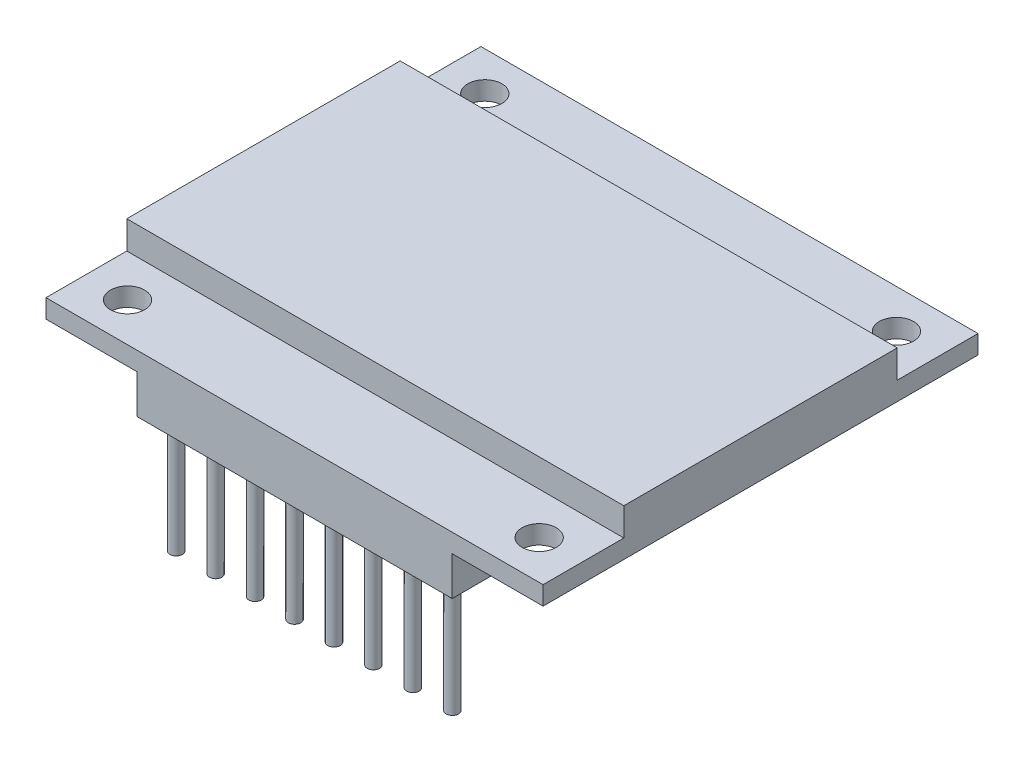
ISO-10303-21;
HEADER;
FILE_DESCRIPTION(('STEP AP214'),'2;1');
FILE_NAME('part.step','',(''),(''),'','','');
FILE_SCHEMA(('AUTOMOTIVE_DESIGN { 1 0 10303 214 1 1 1 1 }'));
ENDSEC;
DATA;
#1=APPLICATION_CONTEXT('core data for automotive mechanical design processes');
#2=APPLICATION_PROTOCOL_DEFINITION('international standard','automotive_design',2000,#1);
#3=PRODUCT_CONTEXT('',#1,'mechanical');
#4=PRODUCT('Part','Part','',(#3));
#5=PRODUCT_RELATED_PRODUCT_CATEGORY('part','',(#4));
#6=PRODUCT_DEFINITION_FORMATION('','',#4);
#7=PRODUCT_DEFINITION_CONTEXT('part definition',#1,'design');
#8=PRODUCT_DEFINITION('design','',#6,#7);
#9=PRODUCT_DEFINITION_SHAPE('','',#8);
#10=(LENGTH_UNIT() NAMED_UNIT(*) SI_UNIT(.MILLI.,.METRE.));
#11=(NAMED_UNIT(*) PLANE_ANGLE_UNIT() SI_UNIT($,.RADIAN.));
#12=(NAMED_UNIT(*) SI_UNIT($,.STERADIAN.) SOLID_ANGLE_UNIT());
#13=UNCERTAINTY_MEASURE_WITH_UNIT(LENGTH_MEASURE(1.E-05),#10,'distance_accuracy_value','');
#14=(GEOMETRIC_REPRESENTATION_CONTEXT(3) GLOBAL_UNCERTAINTY_ASSIGNED_CONTEXT((#13)) GLOBAL_UNIT_ASSIGNED_CONTEXT((#10,
#11,#12)) REPRESENTATION_CONTEXT('',''));
#15=CARTESIAN_POINT('',(0.,0.,0.));
#16=DIRECTION('',(0.,0.,1.));
#17=DIRECTION('',(1.,0.,0.));
#18=AXIS2_PLACEMENT_3D('',#15,#16,#17);
#19=CARTESIAN_POINT('',(0.,0.,0.));
#20=DIRECTION('',(0.,-1.,0.));
#21=DIRECTION('',(0.,0.,-1.));
#22=AXIS2_PLACEMENT_3D('',#19,#20,#21);
#23=PLANE('',#22);
#24=CARTESIAN_POINT('',(2.75,0.,-25.5));
#25=DIRECTION('',(0.,1.,0.));
#26=DIRECTION('',(0.,0.,1.));
#27=AXIS2_PLACEMENT_3D('',#24,#25,#26);
#28=CIRCLE('',#27,1.1);
#29=CARTESIAN_POINT('',(2.75,0.,-24.4));
#30=VERTEX_POINT('',#29);
#31=EDGE_CURVE('E251',#30,#30,#28,.T.);
#32=ORIENTED_EDGE('',*,*,#31,.T.);
#33=EDGE_LOOP('',(#32));
#34=FACE_BOUND('',#33,.T.);
#35=CARTESIAN_POINT('',(2.75,0.,-2.5));
#36=DIRECTION('',(0.,1.,0.));
#37=DIRECTION('',(0.,0.,-1.));
#38=AXIS2_PLACEMENT_3D('',#35,#36,#37);
#39=CIRCLE('',#38,1.1);
#40=CARTESIAN_POINT('',(2.75,0.,-3.6));
#41=VERTEX_POINT('',#40);
#42=EDGE_CURVE('E227',#41,#41,#39,.T.);
#43=ORIENTED_EDGE('',*,*,#42,.T.);
#44=EDGE_LOOP('',(#43));
#45=FACE_BOUND('',#44,.T.);
#46=CARTESIAN_POINT('',(29.25,0.,-2.5));
#47=DIRECTION('',(0.,1.,0.));
#48=DIRECTION('',(0.,0.,1.));
#49=AXIS2_PLACEMENT_3D('',#46,#47,#48);
#50=CIRCLE('',#49,1.1);
#51=CARTESIAN_POINT('',(29.25,0.,-1.40000000000001));
#52=VERTEX_POINT('',#51);
#53=EDGE_CURVE('E236',#52,#52,#50,.T.);
#54=ORIENTED_EDGE('',*,*,#53,.T.);
#55=EDGE_LOOP('',(#54));
#56=FACE_BOUND('',#55,.T.);
#57=CARTESIAN_POINT('',(29.25,0.,-25.5));
#58=DIRECTION('',(0.,1.,0.));
#59=DIRECTION('',(0.,0.,-1.));
#60=AXIS2_PLACEMENT_3D('',#57,#58,#59);
#61=CIRCLE('',#60,1.1);
#62=CARTESIAN_POINT('',(29.25,0.,-26.6));
#63=VERTEX_POINT('',#62);
#64=EDGE_CURVE('E244',#63,#63,#61,.T.);
#65=ORIENTED_EDGE('',*,*,#64,.T.);
#66=EDGE_LOOP('',(#65));
#67=FACE_BOUND('',#66,.T.);
#68=DIRECTION('',(1.,0.,0.));
#69=VECTOR('',#68,1.);
#70=CARTESIAN_POINT('',(5.85,0.,-2.5));
#71=LINE('',#70,#69);
#72=CARTESIAN_POINT('',(5.85,0.,-2.5));
#73=VERTEX_POINT('',#72);
#74=CARTESIAN_POINT('',(26.15,0.,-2.5));
#75=VERTEX_POINT('',#74);
#76=EDGE_CURVE('E736',#73,#75,#71,.T.);
#77=ORIENTED_EDGE('',*,*,#76,.F.);
#78=DIRECTION('',(0.,0.,-1.));
#79=VECTOR('',#78,1.);
#80=CARTESIAN_POINT('',(5.85,0.,0.));
#81=LINE('',#80,#79);
#82=CARTESIAN_POINT('',(5.85,0.,0.));
#83=VERTEX_POINT('',#82);
#84=EDGE_CURVE('E156',#83,#73,#81,.T.);
#85=ORIENTED_EDGE('',*,*,#84,.F.);
#86=DIRECTION('',(1.,0.,0.));
#87=VECTOR('',#86,1.);
#88=CARTESIAN_POINT('',(0.,0.,0.));
#89=LINE('',#88,#87);
#90=CARTESIAN_POINT('',(0.,0.,0.));
#91=VERTEX_POINT('',#90);
#92=EDGE_CURVE('E313',#91,#83,#89,.T.);
#93=ORIENTED_EDGE('',*,*,#92,.F.);
#94=DIRECTION('',(0.,0.,1.));
#95=VECTOR('',#94,1.);
#96=CARTESIAN_POINT('',(0.,0.,0.));
#97=LINE('',#96,#95);
#98=CARTESIAN_POINT('',(0.,0.,-28.));
#99=VERTEX_POINT('',#98);
#100=EDGE_CURVE('E293',#99,#91,#97,.T.);
#101=ORIENTED_EDGE('',*,*,#100,.F.);
#102=DIRECTION('',(-1.,0.,0.));
#103=VECTOR('',#102,1.);
#104=CARTESIAN_POINT('',(0.,0.,-28.));
#105=LINE('',#104,#103);
#106=CARTESIAN_POINT('',(32.,0.,-28.));
#107=VERTEX_POINT('',#106);
#108=EDGE_CURVE('E320',#107,#99,#105,.T.);
#109=ORIENTED_EDGE('',*,*,#108,.F.);
#110=DIRECTION('',(0.,0.,-1.));
#111=VECTOR('',#110,1.);
#112=CARTESIAN_POINT('',(32.,0.,0.));
#113=LINE('',#112,#111);
#114=CARTESIAN_POINT('',(32.,0.,0.));
#115=VERTEX_POINT('',#114);
#116=EDGE_CURVE('E317',#115,#107,#113,.T.);
#117=ORIENTED_EDGE('',*,*,#116,.F.);
#118=CARTESIAN_POINT('',(26.15,0.,0.));
#119=VERTEX_POINT('',#118);
#120=EDGE_CURVE('E312',#119,#115,#89,.T.);
#121=ORIENTED_EDGE('',*,*,#120,.F.);
#122=DIRECTION('',(0.,0.,1.));
#123=VECTOR('',#122,1.);
#124=CARTESIAN_POINT('',(26.15,0.,0.));
#125=LINE('',#124,#123);
#126=EDGE_CURVE('E152',#75,#119,#125,.T.);
#127=ORIENTED_EDGE('',*,*,#126,.F.);
#128=EDGE_LOOP('',(#77,#85,#93,#101,#109,#117,#121,#127));
#129=FACE_BOUND('',#128,.T.);
#130=ADVANCED_FACE('F41',(#34,#45,#56,#67,#129),#23,.T.);
#131=CARTESIAN_POINT('',(0.,1.2,0.));
#132=DIRECTION('',(0.,-1.,0.));
#133=DIRECTION('',(0.,0.,-1.));
#134=AXIS2_PLACEMENT_3D('',#131,#132,#133);
#135=PLANE('',#134);
#136=CARTESIAN_POINT('',(29.25,1.2,-25.5));
#137=DIRECTION('',(0.,1.,0.));
#138=DIRECTION('',(0.,0.,-1.));
#139=AXIS2_PLACEMENT_3D('',#136,#137,#138);
#140=CIRCLE('',#139,1.1);
#141=CARTESIAN_POINT('',(29.25,1.2,-26.6));
#142=VERTEX_POINT('',#141);
#143=EDGE_CURVE('E226',#142,#142,#140,.T.);
#144=ORIENTED_EDGE('',*,*,#143,.F.);
#145=EDGE_LOOP('',(#144));
#146=FACE_BOUND('',#145,.T.);
#147=CARTESIAN_POINT('',(2.75,1.2,-25.5));
#148=DIRECTION('',(0.,1.,0.));
#149=DIRECTION('',(0.,0.,1.));
#150=AXIS2_PLACEMENT_3D('',#147,#148,#149);
#151=CIRCLE('',#150,1.1);
#152=CARTESIAN_POINT('',(2.75,1.2,-24.4));
#153=VERTEX_POINT('',#152);
#154=EDGE_CURVE('E231',#153,#153,#151,.T.);
#155=ORIENTED_EDGE('',*,*,#154,.F.);
#156=EDGE_LOOP('',(#155));
#157=FACE_BOUND('',#156,.T.);
#158=DIRECTION('',(-1.,0.,0.));
#159=VECTOR('',#158,1.);
#160=CARTESIAN_POINT('',(0.,1.2,-22.8));
#161=LINE('',#160,#159);
#162=CARTESIAN_POINT('',(32.,1.2,-22.8));
#163=VERTEX_POINT('',#162);
#164=CARTESIAN_POINT('',(0.,1.2,-22.8));
#165=VERTEX_POINT('',#164);
#166=EDGE_CURVE('E66',#163,#165,#161,.T.);
#167=ORIENTED_EDGE('',*,*,#166,.F.);
#168=DIRECTION('',(0.,0.,-1.));
#169=VECTOR('',#168,1.);
#170=CARTESIAN_POINT('',(32.,1.2,0.));
#171=LINE('',#170,#169);
#172=CARTESIAN_POINT('',(32.,1.2,-28.));
#173=VERTEX_POINT('',#172);
#174=EDGE_CURVE('E301',#163,#173,#171,.T.);
#175=ORIENTED_EDGE('',*,*,#174,.T.);
#176=DIRECTION('',(-1.,0.,0.));
#177=VECTOR('',#176,1.);
#178=CARTESIAN_POINT('',(0.,1.2,-28.));
#179=LINE('',#178,#177);
#180=CARTESIAN_POINT('',(0.,1.2,-28.));
#181=VERTEX_POINT('',#180);
#182=EDGE_CURVE('E305',#173,#181,#179,.T.);
#183=ORIENTED_EDGE('',*,*,#182,.T.);
#184=DIRECTION('',(0.,0.,1.));
#185=VECTOR('',#184,1.);
#186=CARTESIAN_POINT('',(0.,1.2,0.));
#187=LINE('',#186,#185);
#188=EDGE_CURVE('E294',#181,#165,#187,.T.);
#189=ORIENTED_EDGE('',*,*,#188,.T.);
#190=EDGE_LOOP('',(#167,#175,#183,#189));
#191=FACE_BOUND('',#190,.T.);
#192=ADVANCED_FACE('F353',(#146,#157,#191),#135,.F.);
#193=CARTESIAN_POINT('',(29.25,1.2,-2.5));
#194=DIRECTION('',(0.,1.,0.));
#195=DIRECTION('',(0.,0.,1.));
#196=AXIS2_PLACEMENT_3D('',#193,#194,#195);
#197=CIRCLE('',#196,1.1);
#198=CARTESIAN_POINT('',(29.25,1.2,-1.40000000000001));
#199=VERTEX_POINT('',#198);
#200=EDGE_CURVE('E240',#199,#199,#197,.T.);
#201=ORIENTED_EDGE('',*,*,#200,.F.);
#202=EDGE_LOOP('',(#201));
#203=FACE_BOUND('',#202,.T.);
#204=CARTESIAN_POINT('',(2.75,1.2,-2.5));
#205=DIRECTION('',(0.,1.,0.));
#206=DIRECTION('',(0.,0.,-1.));
#207=AXIS2_PLACEMENT_3D('',#204,#205,#206);
#208=CIRCLE('',#207,1.1);
#209=CARTESIAN_POINT('',(2.75,1.2,-3.6));
#210=VERTEX_POINT('',#209);
#211=EDGE_CURVE('E232',#210,#210,#208,.T.);
#212=ORIENTED_EDGE('',*,*,#211,.F.);
#213=EDGE_LOOP('',(#212));
#214=FACE_BOUND('',#213,.T.);
#215=DIRECTION('',(1.,0.,0.));
#216=VECTOR('',#215,1.);
#217=CARTESIAN_POINT('',(0.,1.2,-5.2));
#218=LINE('',#217,#216);
#219=CARTESIAN_POINT('',(0.,1.2,-5.2));
#220=VERTEX_POINT('',#219);
#221=CARTESIAN_POINT('',(32.,1.2,-5.2));
#222=VERTEX_POINT('',#221);
#223=EDGE_CURVE('E255',#220,#222,#218,.T.);
#224=ORIENTED_EDGE('',*,*,#223,.F.);
#225=CARTESIAN_POINT('',(0.,1.2,0.));
#226=VERTEX_POINT('',#225);
#227=EDGE_CURVE('E298',#220,#226,#187,.T.);
#228=ORIENTED_EDGE('',*,*,#227,.T.);
#229=DIRECTION('',(1.,0.,0.));
#230=VECTOR('',#229,1.);
#231=CARTESIAN_POINT('',(0.,1.2,0.));
#232=LINE('',#231,#230);
#233=CARTESIAN_POINT('',(32.,1.2,0.));
#234=VERTEX_POINT('',#233);
#235=EDGE_CURVE('E297',#226,#234,#232,.T.);
#236=ORIENTED_EDGE('',*,*,#235,.T.);
#237=EDGE_CURVE('E302',#234,#222,#171,.T.);
#238=ORIENTED_EDGE('',*,*,#237,.T.);
#239=EDGE_LOOP('',(#224,#228,#236,#238));
#240=FACE_BOUND('',#239,.T.);
#241=ADVANCED_FACE('F369',(#203,#214,#240),#135,.F.);
#242=CARTESIAN_POINT('',(0.,1.2,0.));
#243=DIRECTION('',(1.,0.,0.));
#244=DIRECTION('',(0.,0.,-1.));
#245=AXIS2_PLACEMENT_3D('',#242,#243,#244);
#246=PLANE('',#245);
#247=ORIENTED_EDGE('',*,*,#100,.T.);
#248=DIRECTION('',(0.,-1.,0.));
#249=VECTOR('',#248,1.);
#250=CARTESIAN_POINT('',(0.,1.2,0.));
#251=LINE('',#250,#249);
#252=EDGE_CURVE('E11',#226,#91,#251,.T.);
#253=ORIENTED_EDGE('',*,*,#252,.F.);
#254=ORIENTED_EDGE('',*,*,#227,.F.);
#255=DIRECTION('',(0.,-1.,0.));
#256=VECTOR('',#255,1.);
#257=CARTESIAN_POINT('',(0.,3.,-5.2));
#258=LINE('',#257,#256);
#259=CARTESIAN_POINT('',(0.,3.,-5.2));
#260=VERTEX_POINT('',#259);
#261=EDGE_CURVE('E289',#260,#220,#258,.T.);
#262=ORIENTED_EDGE('',*,*,#261,.F.);
#263=DIRECTION('',(0.,0.,1.));
#264=VECTOR('',#263,1.);
#265=CARTESIAN_POINT('',(0.,3.,-22.8));
#266=LINE('',#265,#264);
#267=CARTESIAN_POINT('',(0.,3.,-22.8));
#268=VERTEX_POINT('',#267);
#269=EDGE_CURVE('E259',#268,#260,#266,.T.);
#270=ORIENTED_EDGE('',*,*,#269,.F.);
#271=DIRECTION('',(0.,-1.,0.));
#272=VECTOR('',#271,1.);
#273=CARTESIAN_POINT('',(0.,3.,-22.8));
#274=LINE('',#273,#272);
#275=EDGE_CURVE('E272',#268,#165,#274,.T.);
#276=ORIENTED_EDGE('',*,*,#275,.T.);
#277=ORIENTED_EDGE('',*,*,#188,.F.);
#278=DIRECTION('',(0.,-1.,0.));
#279=VECTOR('',#278,1.);
#280=CARTESIAN_POINT('',(0.,1.2,-28.));
#281=LINE('',#280,#279);
#282=EDGE_CURVE('E308',#181,#99,#281,.T.);
#283=ORIENTED_EDGE('',*,*,#282,.T.);
#284=EDGE_LOOP('',(#247,#253,#254,#262,#270,#276,#277,#283));
#285=FACE_BOUND('',#284,.T.);
#286=ADVANCED_FACE('F43',(#285),#246,.F.);
#287=CARTESIAN_POINT('',(0.,1.2,0.));
#288=DIRECTION('',(0.,0.,-1.));
#289=DIRECTION('',(-1.,0.,0.));
#290=AXIS2_PLACEMENT_3D('',#287,#288,#289);
#291=PLANE('',#290);
#292=ORIENTED_EDGE('',*,*,#92,.T.);
#293=DIRECTION('',(0.,1.,0.));
#294=VECTOR('',#293,1.);
#295=CARTESIAN_POINT('',(5.85,-2.5,0.));
#296=LINE('',#295,#294);
#297=CARTESIAN_POINT('',(5.85,-2.5,0.));
#298=VERTEX_POINT('',#297);
#299=EDGE_CURVE('E742',#298,#83,#296,.T.);
#300=ORIENTED_EDGE('',*,*,#299,.F.);
#301=DIRECTION('',(-1.,0.,0.));
#302=VECTOR('',#301,1.);
#303=CARTESIAN_POINT('',(5.85,-2.5,0.));
#304=LINE('',#303,#302);
#305=CARTESIAN_POINT('',(26.15,-2.5,0.));
#306=VERTEX_POINT('',#305);
#307=EDGE_CURVE('E148',#306,#298,#304,.T.);
#308=ORIENTED_EDGE('',*,*,#307,.F.);
#309=DIRECTION('',(0.,1.,0.));
#310=VECTOR('',#309,1.);
#311=CARTESIAN_POINT('',(26.15,-2.5,0.));
#312=LINE('',#311,#310);
#313=EDGE_CURVE('E58',#306,#119,#312,.T.);
#314=ORIENTED_EDGE('',*,*,#313,.T.);
#315=ORIENTED_EDGE('',*,*,#120,.T.);
#316=DIRECTION('',(0.,-1.,0.));
#317=VECTOR('',#316,1.);
#318=CARTESIAN_POINT('',(32.,1.2,0.));
#319=LINE('',#318,#317);
#320=EDGE_CURVE('E51',#234,#115,#319,.T.);
#321=ORIENTED_EDGE('',*,*,#320,.F.);
#322=ORIENTED_EDGE('',*,*,#235,.F.);
#323=ORIENTED_EDGE('',*,*,#252,.T.);
#324=EDGE_LOOP('',(#292,#300,#308,#314,#315,#321,#322,#323));
#325=FACE_BOUND('',#324,.T.);
#326=ADVANCED_FACE('F362',(#325),#291,.F.);
#327=CARTESIAN_POINT('',(32.,1.2,0.));
#328=DIRECTION('',(-1.,0.,0.));
#329=DIRECTION('',(0.,0.,1.));
#330=AXIS2_PLACEMENT_3D('',#327,#328,#329);
#331=PLANE('',#330);
#332=ORIENTED_EDGE('',*,*,#116,.T.);
#333=DIRECTION('',(0.,-1.,0.));
#334=VECTOR('',#333,1.);
#335=CARTESIAN_POINT('',(32.,1.2,-28.));
#336=LINE('',#335,#334);
#337=EDGE_CURVE('E326',#173,#107,#336,.T.);
#338=ORIENTED_EDGE('',*,*,#337,.F.);
#339=ORIENTED_EDGE('',*,*,#174,.F.);
#340=DIRECTION('',(0.,-1.,0.));
#341=VECTOR('',#340,1.);
#342=CARTESIAN_POINT('',(32.,3.,-22.8));
#343=LINE('',#342,#341);
#344=CARTESIAN_POINT('',(32.,3.,-22.8));
#345=VERTEX_POINT('',#344);
#346=EDGE_CURVE('E281',#345,#163,#343,.T.);
#347=ORIENTED_EDGE('',*,*,#346,.F.);
#348=DIRECTION('',(0.,0.,-1.));
#349=VECTOR('',#348,1.);
#350=CARTESIAN_POINT('',(32.,3.,-22.8));
#351=LINE('',#350,#349);
#352=CARTESIAN_POINT('',(32.,3.,-5.2));
#353=VERTEX_POINT('',#352);
#354=EDGE_CURVE('E266',#353,#345,#351,.T.);
#355=ORIENTED_EDGE('',*,*,#354,.F.);
#356=DIRECTION('',(0.,-1.,0.));
#357=VECTOR('',#356,1.);
#358=CARTESIAN_POINT('',(32.,3.,-5.2));
#359=LINE('',#358,#357);
#360=EDGE_CURVE('E285',#353,#222,#359,.T.);
#361=ORIENTED_EDGE('',*,*,#360,.T.);
#362=ORIENTED_EDGE('',*,*,#237,.F.);
#363=ORIENTED_EDGE('',*,*,#320,.T.);
#364=EDGE_LOOP('',(#332,#338,#339,#347,#355,#361,#362,#363));
#365=FACE_BOUND('',#364,.T.);
#366=ADVANCED_FACE('F336',(#365),#331,.F.);
#367=CARTESIAN_POINT('',(0.,1.2,-28.));
#368=DIRECTION('',(0.,0.,1.));
#369=DIRECTION('',(1.,0.,0.));
#370=AXIS2_PLACEMENT_3D('',#367,#368,#369);
#371=PLANE('',#370);
#372=ORIENTED_EDGE('',*,*,#108,.T.);
#373=ORIENTED_EDGE('',*,*,#282,.F.);
#374=ORIENTED_EDGE('',*,*,#182,.F.);
#375=ORIENTED_EDGE('',*,*,#337,.T.);
#376=EDGE_LOOP('',(#372,#373,#374,#375));
#377=FACE_BOUND('',#376,.T.);
#378=ADVANCED_FACE('F346',(#377),#371,.F.);
#379=CARTESIAN_POINT('',(0.,3.,-5.2));
#380=DIRECTION('',(0.,0.,-1.));
#381=DIRECTION('',(-1.,0.,0.));
#382=AXIS2_PLACEMENT_3D('',#379,#380,#381);
#383=PLANE('',#382);
#384=ORIENTED_EDGE('',*,*,#223,.T.);
#385=ORIENTED_EDGE('',*,*,#360,.F.);
#386=DIRECTION('',(1.,0.,0.));
#387=VECTOR('',#386,1.);
#388=CARTESIAN_POINT('',(0.,3.,-5.2));
#389=LINE('',#388,#387);
#390=EDGE_CURVE('E263',#260,#353,#389,.T.);
#391=ORIENTED_EDGE('',*,*,#390,.F.);
#392=ORIENTED_EDGE('',*,*,#261,.T.);
#393=EDGE_LOOP('',(#384,#385,#391,#392));
#394=FACE_BOUND('',#393,.T.);
#395=ADVANCED_FACE('F382',(#394),#383,.F.);
#396=CARTESIAN_POINT('',(0.,3.,-22.8));
#397=DIRECTION('',(0.,0.,1.));
#398=DIRECTION('',(1.,0.,0.));
#399=AXIS2_PLACEMENT_3D('',#396,#397,#398);
#400=PLANE('',#399);
#401=ORIENTED_EDGE('',*,*,#166,.T.);
#402=ORIENTED_EDGE('',*,*,#275,.F.);
#403=DIRECTION('',(-1.,0.,0.));
#404=VECTOR('',#403,1.);
#405=CARTESIAN_POINT('',(0.,3.,-22.8));
#406=LINE('',#405,#404);
#407=EDGE_CURVE('E269',#345,#268,#406,.T.);
#408=ORIENTED_EDGE('',*,*,#407,.F.);
#409=ORIENTED_EDGE('',*,*,#346,.T.);
#410=EDGE_LOOP('',(#401,#402,#408,#409));
#411=FACE_BOUND('',#410,.T.);
#412=ADVANCED_FACE('F355',(#411),#400,.F.);
#413=CARTESIAN_POINT('',(0.,3.,0.));
#414=DIRECTION('',(0.,1.,0.));
#415=DIRECTION('',(0.,0.,1.));
#416=AXIS2_PLACEMENT_3D('',#413,#414,#415);
#417=PLANE('',#416);
#418=ORIENTED_EDGE('',*,*,#269,.T.);
#419=ORIENTED_EDGE('',*,*,#390,.T.);
#420=ORIENTED_EDGE('',*,*,#354,.T.);
#421=ORIENTED_EDGE('',*,*,#407,.T.);
#422=EDGE_LOOP('',(#418,#419,#420,#421));
#423=FACE_BOUND('',#422,.T.);
#424=ADVANCED_FACE('F390',(#423),#417,.T.);
#425=CARTESIAN_POINT('',(2.75,0.,-25.5));
#426=DIRECTION('',(0.,1.,0.));
#427=DIRECTION('',(0.,0.,1.));
#428=AXIS2_PLACEMENT_3D('',#425,#426,#427);
#429=CYLINDRICAL_SURFACE('',#428,1.1);
#430=ORIENTED_EDGE('',*,*,#31,.F.);
#431=EDGE_LOOP('',(#430));
#432=FACE_BOUND('',#431,.T.);
#433=ORIENTED_EDGE('',*,*,#154,.T.);
#434=EDGE_LOOP('',(#433));
#435=FACE_BOUND('',#434,.T.);
#436=ADVANCED_FACE('F395',(#432,#435),#429,.F.);
#437=CARTESIAN_POINT('',(2.75,0.,-2.5));
#438=DIRECTION('',(0.,1.,0.));
#439=DIRECTION('',(0.,0.,1.));
#440=AXIS2_PLACEMENT_3D('',#437,#438,#439);
#441=CYLINDRICAL_SURFACE('',#440,1.1);
#442=ORIENTED_EDGE('',*,*,#42,.F.);
#443=EDGE_LOOP('',(#442));
#444=FACE_BOUND('',#443,.T.);
#445=ORIENTED_EDGE('',*,*,#211,.T.);
#446=EDGE_LOOP('',(#445));
#447=FACE_BOUND('',#446,.T.);
#448=ADVANCED_FACE('F399',(#444,#447),#441,.F.);
#449=CARTESIAN_POINT('',(29.25,0.,-2.5));
#450=DIRECTION('',(0.,1.,0.));
#451=DIRECTION('',(0.,0.,1.));
#452=AXIS2_PLACEMENT_3D('',#449,#450,#451);
#453=CYLINDRICAL_SURFACE('',#452,1.1);
#454=ORIENTED_EDGE('',*,*,#53,.F.);
#455=EDGE_LOOP('',(#454));
#456=FACE_BOUND('',#455,.T.);
#457=ORIENTED_EDGE('',*,*,#200,.T.);
#458=EDGE_LOOP('',(#457));
#459=FACE_BOUND('',#458,.T.);
#460=ADVANCED_FACE('F404',(#456,#459),#453,.F.);
#461=CARTESIAN_POINT('',(29.25,0.,-25.5));
#462=DIRECTION('',(0.,1.,0.));
#463=DIRECTION('',(0.,0.,1.));
#464=AXIS2_PLACEMENT_3D('',#461,#462,#463);
#465=CYLINDRICAL_SURFACE('',#464,1.1);
#466=ORIENTED_EDGE('',*,*,#64,.F.);
#467=EDGE_LOOP('',(#466));
#468=FACE_BOUND('',#467,.T.);
#469=ORIENTED_EDGE('',*,*,#143,.T.);
#470=EDGE_LOOP('',(#469));
#471=FACE_BOUND('',#470,.T.);
#472=ADVANCED_FACE('F401',(#468,#471),#465,.F.);
#473=CARTESIAN_POINT('',(5.85,-2.5,0.));
#474=DIRECTION('',(1.,0.,0.));
#475=DIRECTION('',(0.,0.,-1.));
#476=AXIS2_PLACEMENT_3D('',#473,#474,#475);
#477=PLANE('',#476);
#478=ORIENTED_EDGE('',*,*,#84,.T.);
#479=DIRECTION('',(0.,1.,0.));
#480=VECTOR('',#479,1.);
#481=CARTESIAN_POINT('',(5.85,-2.5,-2.5));
#482=LINE('',#481,#480);
#483=CARTESIAN_POINT('',(5.85,-2.5,-2.5));
#484=VERTEX_POINT('',#483);
#485=EDGE_CURVE('E136',#484,#73,#482,.T.);
#486=ORIENTED_EDGE('',*,*,#485,.F.);
#487=DIRECTION('',(0.,0.,-1.));
#488=VECTOR('',#487,1.);
#489=CARTESIAN_POINT('',(5.85,-2.5,0.));
#490=LINE('',#489,#488);
#491=EDGE_CURVE('E144',#298,#484,#490,.T.);
#492=ORIENTED_EDGE('',*,*,#491,.F.);
#493=ORIENTED_EDGE('',*,*,#299,.T.);
#494=EDGE_LOOP('',(#478,#486,#492,#493));
#495=FACE_BOUND('',#494,.T.);
#496=ADVANCED_FACE('F154',(#495),#477,.F.);
#497=CARTESIAN_POINT('',(5.85,-2.5,-2.5));
#498=DIRECTION('',(0.,0.,1.));
#499=DIRECTION('',(1.,0.,0.));
#500=AXIS2_PLACEMENT_3D('',#497,#498,#499);
#501=PLANE('',#500);
#502=ORIENTED_EDGE('',*,*,#76,.T.);
#503=DIRECTION('',(0.,1.,0.));
#504=VECTOR('',#503,1.);
#505=CARTESIAN_POINT('',(26.15,-2.5,-2.5));
#506=LINE('',#505,#504);
#507=CARTESIAN_POINT('',(26.15,-2.5,-2.5));
#508=VERTEX_POINT('',#507);
#509=EDGE_CURVE('E139',#508,#75,#506,.T.);
#510=ORIENTED_EDGE('',*,*,#509,.F.);
#511=DIRECTION('',(1.,0.,0.));
#512=VECTOR('',#511,1.);
#513=CARTESIAN_POINT('',(5.85,-2.5,-2.5));
#514=LINE('',#513,#512);
#515=EDGE_CURVE('E132',#484,#508,#514,.T.);
#516=ORIENTED_EDGE('',*,*,#515,.F.);
#517=ORIENTED_EDGE('',*,*,#485,.T.);
#518=EDGE_LOOP('',(#502,#510,#516,#517));
#519=FACE_BOUND('',#518,.T.);
#520=ADVANCED_FACE('F134',(#519),#501,.F.);
#521=CARTESIAN_POINT('',(26.15,-2.5,0.));
#522=DIRECTION('',(-1.,0.,0.));
#523=DIRECTION('',(0.,0.,1.));
#524=AXIS2_PLACEMENT_3D('',#521,#522,#523);
#525=PLANE('',#524);
#526=ORIENTED_EDGE('',*,*,#126,.T.);
#527=ORIENTED_EDGE('',*,*,#313,.F.);
#528=DIRECTION('',(0.,0.,1.));
#529=VECTOR('',#528,1.);
#530=CARTESIAN_POINT('',(26.15,-2.5,0.));
#531=LINE('',#530,#529);
#532=EDGE_CURVE('E143',#508,#306,#531,.T.);
#533=ORIENTED_EDGE('',*,*,#532,.F.);
#534=ORIENTED_EDGE('',*,*,#509,.T.);
#535=EDGE_LOOP('',(#526,#527,#533,#534));
#536=FACE_BOUND('',#535,.T.);
#537=ADVANCED_FACE('F480',(#536),#525,.F.);
#538=CARTESIAN_POINT('',(0.,-2.5,0.));
#539=DIRECTION('',(0.,-1.,0.));
#540=DIRECTION('',(0.,0.,-1.));
#541=AXIS2_PLACEMENT_3D('',#538,#539,#540);
#542=PLANE('',#541);
#543=CARTESIAN_POINT('',(7.11,-2.5,-1.27));
#544=DIRECTION('',(0.,-1.,0.));
#545=DIRECTION('',(0.,0.,-1.));
#546=AXIS2_PLACEMENT_3D('',#543,#544,#545);
#547=CIRCLE('',#546,0.4);
#548=CARTESIAN_POINT('',(7.11,-2.5,-1.67));
#549=VERTEX_POINT('',#548);
#550=EDGE_CURVE('E190',#549,#549,#547,.T.);
#551=ORIENTED_EDGE('',*,*,#550,.F.);
#552=EDGE_LOOP('',(#551));
#553=FACE_BOUND('',#552,.T.);
#554=CARTESIAN_POINT('',(9.65,-2.5,-1.27));
#555=DIRECTION('',(0.,-1.,0.));
#556=DIRECTION('',(0.,0.,-1.));
#557=AXIS2_PLACEMENT_3D('',#554,#555,#556);
#558=CIRCLE('',#557,0.399999999999999);
#559=CARTESIAN_POINT('',(9.65,-2.5,-1.67));
#560=VERTEX_POINT('',#559);
#561=EDGE_CURVE('E186',#560,#560,#558,.T.);
#562=ORIENTED_EDGE('',*,*,#561,.F.);
#563=EDGE_LOOP('',(#562));
#564=FACE_BOUND('',#563,.T.);
#565=CARTESIAN_POINT('',(12.19,-2.5,-1.27));
#566=DIRECTION('',(0.,-1.,0.));
#567=DIRECTION('',(0.,0.,-1.));
#568=AXIS2_PLACEMENT_3D('',#565,#566,#567);
#569=CIRCLE('',#568,0.399999999999999);
#570=CARTESIAN_POINT('',(12.19,-2.5,-1.67));
#571=VERTEX_POINT('',#570);
#572=EDGE_CURVE('E182',#571,#571,#569,.T.);
#573=ORIENTED_EDGE('',*,*,#572,.F.);
#574=EDGE_LOOP('',(#573));
#575=FACE_BOUND('',#574,.T.);
#576=CARTESIAN_POINT('',(14.73,-2.5,-1.27));
#577=DIRECTION('',(0.,-1.,0.));
#578=DIRECTION('',(0.,0.,-1.));
#579=AXIS2_PLACEMENT_3D('',#576,#577,#578);
#580=CIRCLE('',#579,0.399999999999999);
#581=CARTESIAN_POINT('',(14.73,-2.5,-1.67));
#582=VERTEX_POINT('',#581);
#583=EDGE_CURVE('E178',#582,#582,#580,.T.);
#584=ORIENTED_EDGE('',*,*,#583,.F.);
#585=EDGE_LOOP('',(#584));
#586=FACE_BOUND('',#585,.T.);
#587=CARTESIAN_POINT('',(17.27,-2.5,-1.27));
#588=DIRECTION('',(0.,-1.,0.));
#589=DIRECTION('',(0.,0.,-1.));
#590=AXIS2_PLACEMENT_3D('',#587,#588,#589);
#591=CIRCLE('',#590,0.399999999999998);
#592=CARTESIAN_POINT('',(17.27,-2.5,-1.67));
#593=VERTEX_POINT('',#592);
#594=EDGE_CURVE('E174',#593,#593,#591,.T.);
#595=ORIENTED_EDGE('',*,*,#594,.F.);
#596=EDGE_LOOP('',(#595));
#597=FACE_BOUND('',#596,.T.);
#598=CARTESIAN_POINT('',(19.81,-2.5,-1.27));
#599=DIRECTION('',(0.,-1.,0.));
#600=DIRECTION('',(0.,0.,-1.));
#601=AXIS2_PLACEMENT_3D('',#598,#599,#600);
#602=CIRCLE('',#601,0.399999999999998);
#603=CARTESIAN_POINT('',(19.81,-2.5,-1.67));
#604=VERTEX_POINT('',#603);
#605=EDGE_CURVE('E170',#604,#604,#602,.T.);
#606=ORIENTED_EDGE('',*,*,#605,.F.);
#607=EDGE_LOOP('',(#606));
#608=FACE_BOUND('',#607,.T.);
#609=CARTESIAN_POINT('',(22.35,-2.5,-1.27));
#610=DIRECTION('',(0.,-1.,0.));
#611=DIRECTION('',(0.,0.,-1.));
#612=AXIS2_PLACEMENT_3D('',#609,#610,#611);
#613=CIRCLE('',#612,0.400000000000001);
#614=CARTESIAN_POINT('',(22.35,-2.5,-1.67));
#615=VERTEX_POINT('',#614);
#616=EDGE_CURVE('E163',#615,#615,#613,.T.);
#617=ORIENTED_EDGE('',*,*,#616,.F.);
#618=EDGE_LOOP('',(#617));
#619=FACE_BOUND('',#618,.T.);
#620=CARTESIAN_POINT('',(24.89,-2.5,-1.27));
#621=DIRECTION('',(0.,-1.,0.));
#622=DIRECTION('',(0.,0.,-1.));
#623=AXIS2_PLACEMENT_3D('',#620,#621,#622);
#624=CIRCLE('',#623,0.400000000000001);
#625=CARTESIAN_POINT('',(24.89,-2.5,-1.67));
#626=VERTEX_POINT('',#625);
#627=EDGE_CURVE('E45',#626,#626,#624,.T.);
#628=ORIENTED_EDGE('',*,*,#627,.F.);
#629=EDGE_LOOP('',(#628));
#630=FACE_BOUND('',#629,.T.);
#631=ORIENTED_EDGE('',*,*,#491,.T.);
#632=ORIENTED_EDGE('',*,*,#515,.T.);
#633=ORIENTED_EDGE('',*,*,#532,.T.);
#634=ORIENTED_EDGE('',*,*,#307,.T.);
#635=EDGE_LOOP('',(#631,#632,#633,#634));
#636=FACE_BOUND('',#635,.T.);
#637=ADVANCED_FACE('F147',(#553,#564,#575,#586,#597,#608,#619,#630,#636),#542,.T.);
#638=CARTESIAN_POINT('',(22.35,-10.,-1.27));
#639=DIRECTION('',(0.,-1.,0.));
#640=DIRECTION('',(0.,0.,-1.));
#641=AXIS2_PLACEMENT_3D('',#638,#639,#640);
#642=PLANE('',#641);
#643=CARTESIAN_POINT('',(22.35,-10.,-1.27));
#644=DIRECTION('',(0.,-1.,0.));
#645=DIRECTION('',(0.,0.,-1.));
#646=AXIS2_PLACEMENT_3D('',#643,#644,#645);
#647=CIRCLE('',#646,0.400000000000001);
#648=CARTESIAN_POINT('',(22.35,-10.,-1.67));
#649=VERTEX_POINT('',#648);
#650=EDGE_CURVE('E198',#649,#649,#647,.T.);
#651=ORIENTED_EDGE('',*,*,#650,.T.);
#652=EDGE_LOOP('',(#651));
#653=FACE_BOUND('',#652,.T.);
#654=ADVANCED_FACE('F464',(#653),#642,.T.);
#655=CARTESIAN_POINT('',(22.35,-10.,-1.27));
#656=DIRECTION('',(0.,1.,0.));
#657=DIRECTION('',(0.,0.,1.));
#658=AXIS2_PLACEMENT_3D('',#655,#656,#657);
#659=CYLINDRICAL_SURFACE('',#658,0.400000000000001);
#660=ORIENTED_EDGE('',*,*,#616,.T.);
#661=EDGE_LOOP('',(#660));
#662=FACE_BOUND('',#661,.T.);
#663=ORIENTED_EDGE('',*,*,#650,.F.);
#664=EDGE_LOOP('',(#663));
#665=FACE_BOUND('',#664,.T.);
#666=ADVANCED_FACE('F460',(#662,#665),#659,.T.);
#667=CARTESIAN_POINT('',(19.81,-10.,-1.27));
#668=DIRECTION('',(0.,-1.,0.));
#669=DIRECTION('',(0.,0.,-1.));
#670=AXIS2_PLACEMENT_3D('',#667,#668,#669);
#671=PLANE('',#670);
#672=CARTESIAN_POINT('',(19.81,-10.,-1.27));
#673=DIRECTION('',(0.,-1.,0.));
#674=DIRECTION('',(0.,0.,-1.));
#675=AXIS2_PLACEMENT_3D('',#672,#673,#674);
#676=CIRCLE('',#675,0.399999999999998);
#677=CARTESIAN_POINT('',(19.81,-10.,-1.67));
#678=VERTEX_POINT('',#677);
#679=EDGE_CURVE('E202',#678,#678,#676,.T.);
#680=ORIENTED_EDGE('',*,*,#679,.T.);
#681=EDGE_LOOP('',(#680));
#682=FACE_BOUND('',#681,.T.);
#683=ADVANCED_FACE('F456',(#682),#671,.T.);
#684=CARTESIAN_POINT('',(19.81,-10.,-1.27));
#685=DIRECTION('',(0.,1.,0.));
#686=DIRECTION('',(0.,0.,1.));
#687=AXIS2_PLACEMENT_3D('',#684,#685,#686);
#688=CYLINDRICAL_SURFACE('',#687,0.399999999999998);
#689=ORIENTED_EDGE('',*,*,#605,.T.);
#690=EDGE_LOOP('',(#689));
#691=FACE_BOUND('',#690,.T.);
#692=ORIENTED_EDGE('',*,*,#679,.F.);
#693=EDGE_LOOP('',(#692));
#694=FACE_BOUND('',#693,.T.);
#695=ADVANCED_FACE('F452',(#691,#694),#688,.T.);
#696=CARTESIAN_POINT('',(17.27,-10.,-1.27));
#697=DIRECTION('',(0.,-1.,0.));
#698=DIRECTION('',(0.,0.,-1.));
#699=AXIS2_PLACEMENT_3D('',#696,#697,#698);
#700=PLANE('',#699);
#701=CARTESIAN_POINT('',(17.27,-10.,-1.27));
#702=DIRECTION('',(0.,-1.,0.));
#703=DIRECTION('',(0.,0.,-1.));
#704=AXIS2_PLACEMENT_3D('',#701,#702,#703);
#705=CIRCLE('',#704,0.399999999999998);
#706=CARTESIAN_POINT('',(17.27,-10.,-1.67));
#707=VERTEX_POINT('',#706);
#708=EDGE_CURVE('E206',#707,#707,#705,.T.);
#709=ORIENTED_EDGE('',*,*,#708,.T.);
#710=EDGE_LOOP('',(#709));
#711=FACE_BOUND('',#710,.T.);
#712=ADVANCED_FACE('F448',(#711),#700,.T.);
#713=CARTESIAN_POINT('',(17.27,-10.,-1.27));
#714=DIRECTION('',(0.,1.,0.));
#715=DIRECTION('',(0.,0.,1.));
#716=AXIS2_PLACEMENT_3D('',#713,#714,#715);
#717=CYLINDRICAL_SURFACE('',#716,0.399999999999998);
#718=ORIENTED_EDGE('',*,*,#594,.T.);
#719=EDGE_LOOP('',(#718));
#720=FACE_BOUND('',#719,.T.);
#721=ORIENTED_EDGE('',*,*,#708,.F.);
#722=EDGE_LOOP('',(#721));
#723=FACE_BOUND('',#722,.T.);
#724=ADVANCED_FACE('F444',(#720,#723),#717,.T.);
#725=CARTESIAN_POINT('',(14.73,-10.,-1.27));
#726=DIRECTION('',(0.,-1.,0.));
#727=DIRECTION('',(0.,0.,-1.));
#728=AXIS2_PLACEMENT_3D('',#725,#726,#727);
#729=PLANE('',#728);
#730=CARTESIAN_POINT('',(14.73,-10.,-1.27));
#731=DIRECTION('',(0.,-1.,0.));
#732=DIRECTION('',(0.,0.,-1.));
#733=AXIS2_PLACEMENT_3D('',#730,#731,#732);
#734=CIRCLE('',#733,0.399999999999999);
#735=CARTESIAN_POINT('',(14.73,-10.,-1.67));
#736=VERTEX_POINT('',#735);
#737=EDGE_CURVE('E210',#736,#736,#734,.T.);
#738=ORIENTED_EDGE('',*,*,#737,.T.);
#739=EDGE_LOOP('',(#738));
#740=FACE_BOUND('',#739,.T.);
#741=ADVANCED_FACE('F440',(#740),#729,.T.);
#742=CARTESIAN_POINT('',(14.73,-10.,-1.27));
#743=DIRECTION('',(0.,1.,0.));
#744=DIRECTION('',(0.,0.,1.));
#745=AXIS2_PLACEMENT_3D('',#742,#743,#744);
#746=CYLINDRICAL_SURFACE('',#745,0.399999999999999);
#747=ORIENTED_EDGE('',*,*,#583,.T.);
#748=EDGE_LOOP('',(#747));
#749=FACE_BOUND('',#748,.T.);
#750=ORIENTED_EDGE('',*,*,#737,.F.);
#751=EDGE_LOOP('',(#750));
#752=FACE_BOUND('',#751,.T.);
#753=ADVANCED_FACE('F436',(#749,#752),#746,.T.);
#754=CARTESIAN_POINT('',(12.19,-10.,-1.27));
#755=DIRECTION('',(0.,-1.,0.));
#756=DIRECTION('',(0.,0.,-1.));
#757=AXIS2_PLACEMENT_3D('',#754,#755,#756);
#758=PLANE('',#757);
#759=CARTESIAN_POINT('',(12.19,-10.,-1.27));
#760=DIRECTION('',(0.,-1.,0.));
#761=DIRECTION('',(0.,0.,-1.));
#762=AXIS2_PLACEMENT_3D('',#759,#760,#761);
#763=CIRCLE('',#762,0.399999999999999);
#764=CARTESIAN_POINT('',(12.19,-10.,-1.67));
#765=VERTEX_POINT('',#764);
#766=EDGE_CURVE('E214',#765,#765,#763,.T.);
#767=ORIENTED_EDGE('',*,*,#766,.T.);
#768=EDGE_LOOP('',(#767));
#769=FACE_BOUND('',#768,.T.);
#770=ADVANCED_FACE('F432',(#769),#758,.T.);
#771=CARTESIAN_POINT('',(12.19,-10.,-1.27));
#772=DIRECTION('',(0.,1.,0.));
#773=DIRECTION('',(0.,0.,1.));
#774=AXIS2_PLACEMENT_3D('',#771,#772,#773);
#775=CYLINDRICAL_SURFACE('',#774,0.399999999999999);
#776=ORIENTED_EDGE('',*,*,#572,.T.);
#777=EDGE_LOOP('',(#776));
#778=FACE_BOUND('',#777,.T.);
#779=ORIENTED_EDGE('',*,*,#766,.F.);
#780=EDGE_LOOP('',(#779));
#781=FACE_BOUND('',#780,.T.);
#782=ADVANCED_FACE('F428',(#778,#781),#775,.T.);
#783=CARTESIAN_POINT('',(9.65,-10.,-1.27));
#784=DIRECTION('',(0.,-1.,0.));
#785=DIRECTION('',(0.,0.,-1.));
#786=AXIS2_PLACEMENT_3D('',#783,#784,#785);
#787=PLANE('',#786);
#788=CARTESIAN_POINT('',(9.65,-10.,-1.27));
#789=DIRECTION('',(0.,-1.,0.));
#790=DIRECTION('',(0.,0.,-1.));
#791=AXIS2_PLACEMENT_3D('',#788,#789,#790);
#792=CIRCLE('',#791,0.399999999999999);
#793=CARTESIAN_POINT('',(9.65,-10.,-1.67));
#794=VERTEX_POINT('',#793);
#795=EDGE_CURVE('E218',#794,#794,#792,.T.);
#796=ORIENTED_EDGE('',*,*,#795,.T.);
#797=EDGE_LOOP('',(#796));
#798=FACE_BOUND('',#797,.T.);
#799=ADVANCED_FACE('F424',(#798),#787,.T.);
#800=CARTESIAN_POINT('',(9.65,-10.,-1.27));
#801=DIRECTION('',(0.,1.,0.));
#802=DIRECTION('',(0.,0.,1.));
#803=AXIS2_PLACEMENT_3D('',#800,#801,#802);
#804=CYLINDRICAL_SURFACE('',#803,0.399999999999999);
#805=ORIENTED_EDGE('',*,*,#561,.T.);
#806=EDGE_LOOP('',(#805));
#807=FACE_BOUND('',#806,.T.);
#808=ORIENTED_EDGE('',*,*,#795,.F.);
#809=EDGE_LOOP('',(#808));
#810=FACE_BOUND('',#809,.T.);
#811=ADVANCED_FACE('F420',(#807,#810),#804,.T.);
#812=CARTESIAN_POINT('',(7.11,-10.,-1.27));
#813=DIRECTION('',(0.,-1.,0.));
#814=DIRECTION('',(0.,0.,-1.));
#815=AXIS2_PLACEMENT_3D('',#812,#813,#814);
#816=PLANE('',#815);
#817=CARTESIAN_POINT('',(7.11,-10.,-1.27));
#818=DIRECTION('',(0.,-1.,0.));
#819=DIRECTION('',(0.,0.,-1.));
#820=AXIS2_PLACEMENT_3D('',#817,#818,#819);
#821=CIRCLE('',#820,0.4);
#822=CARTESIAN_POINT('',(7.11,-10.,-1.67));
#823=VERTEX_POINT('',#822);
#824=EDGE_CURVE('E222',#823,#823,#821,.T.);
#825=ORIENTED_EDGE('',*,*,#824,.T.);
#826=EDGE_LOOP('',(#825));
#827=FACE_BOUND('',#826,.T.);
#828=ADVANCED_FACE('F416',(#827),#816,.T.);
#829=CARTESIAN_POINT('',(7.11,-10.,-1.27));
#830=DIRECTION('',(0.,1.,0.));
#831=DIRECTION('',(0.,0.,1.));
#832=AXIS2_PLACEMENT_3D('',#829,#830,#831);
#833=CYLINDRICAL_SURFACE('',#832,0.4);
#834=ORIENTED_EDGE('',*,*,#550,.T.);
#835=EDGE_LOOP('',(#834));
#836=FACE_BOUND('',#835,.T.);
#837=ORIENTED_EDGE('',*,*,#824,.F.);
#838=EDGE_LOOP('',(#837));
#839=FACE_BOUND('',#838,.T.);
#840=ADVANCED_FACE('F412',(#836,#839),#833,.T.);
#841=CARTESIAN_POINT('',(24.89,-10.,-1.27));
#842=DIRECTION('',(0.,-1.,0.));
#843=DIRECTION('',(0.,0.,-1.));
#844=AXIS2_PLACEMENT_3D('',#841,#842,#843);
#845=PLANE('',#844);
#846=CARTESIAN_POINT('',(24.89,-10.,-1.27));
#847=DIRECTION('',(0.,-1.,0.));
#848=DIRECTION('',(0.,0.,-1.));
#849=AXIS2_PLACEMENT_3D('',#846,#847,#848);
#850=CIRCLE('',#849,0.400000000000001);
#851=CARTESIAN_POINT('',(24.89,-10.,-1.67));
#852=VERTEX_POINT('',#851);
#853=EDGE_CURVE('E194',#852,#852,#850,.T.);
#854=ORIENTED_EDGE('',*,*,#853,.T.);
#855=EDGE_LOOP('',(#854));
#856=FACE_BOUND('',#855,.T.);
#857=ADVANCED_FACE('F415',(#856),#845,.T.);
#858=CARTESIAN_POINT('',(24.89,-10.,-1.27));
#859=DIRECTION('',(0.,1.,0.));
#860=DIRECTION('',(0.,0.,1.));
#861=AXIS2_PLACEMENT_3D('',#858,#859,#860);
#862=CYLINDRICAL_SURFACE('',#861,0.400000000000001);
#863=ORIENTED_EDGE('',*,*,#627,.T.);
#864=EDGE_LOOP('',(#863));
#865=FACE_BOUND('',#864,.T.);
#866=ORIENTED_EDGE('',*,*,#853,.F.);
#867=EDGE_LOOP('',(#866));
#868=FACE_BOUND('',#867,.T.);
#869=ADVANCED_FACE('F469',(#865,#868),#862,.T.);
#870=CLOSED_SHELL('',(#130,#192,#241,#286,#326,#366,#378,#395,#412,#424,#436,#448,#460,#472,
#496,#520,#537,#637,#654,#666,#683,#695,#712,#724,#741,#753,#770,#782,#799,#811,#828,#840,#857,#869));
#871=MANIFOLD_SOLID_BREP('B2',#870);
#872=ADVANCED_BREP_SHAPE_REPRESENTATION('',(#18,#871),#14);
#873=SHAPE_DEFINITION_REPRESENTATION(#9,#872);
ENDSEC;
END-ISO-10303-21;
